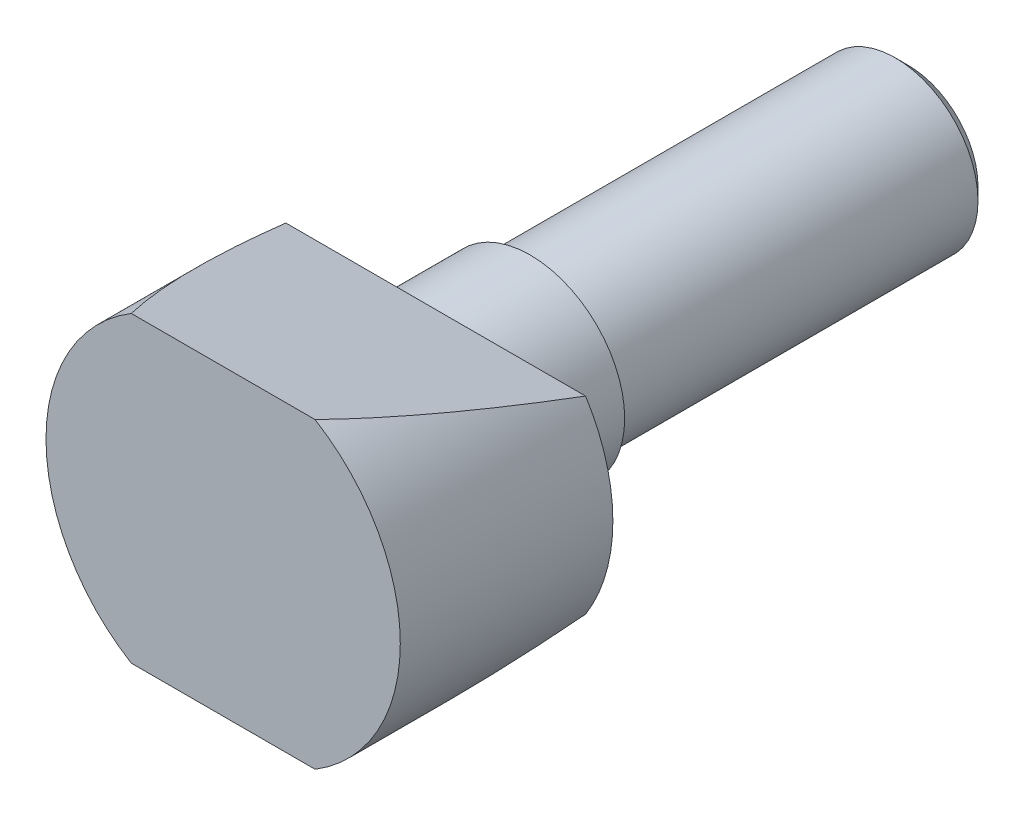
ISO-10303-21;
HEADER;
FILE_DESCRIPTION(('STEP AP214'),'2;1');
FILE_NAME('part.step','',(''),(''),'','','');
FILE_SCHEMA(('AUTOMOTIVE_DESIGN { 1 0 10303 214 1 1 1 1 }'));
ENDSEC;
DATA;
#1=APPLICATION_CONTEXT('core data for automotive mechanical design processes');
#2=APPLICATION_PROTOCOL_DEFINITION('international standard','automotive_design',2000,#1);
#3=PRODUCT_CONTEXT('',#1,'mechanical');
#4=PRODUCT('Part','Part','',(#3));
#5=PRODUCT_RELATED_PRODUCT_CATEGORY('part','',(#4));
#6=PRODUCT_DEFINITION_FORMATION('','',#4);
#7=PRODUCT_DEFINITION_CONTEXT('part definition',#1,'design');
#8=PRODUCT_DEFINITION('design','',#6,#7);
#9=PRODUCT_DEFINITION_SHAPE('','',#8);
#10=(LENGTH_UNIT() NAMED_UNIT(*) SI_UNIT(.MILLI.,.METRE.));
#11=(NAMED_UNIT(*) PLANE_ANGLE_UNIT() SI_UNIT($,.RADIAN.));
#12=(NAMED_UNIT(*) SI_UNIT($,.STERADIAN.) SOLID_ANGLE_UNIT());
#13=UNCERTAINTY_MEASURE_WITH_UNIT(LENGTH_MEASURE(1.E-05),#10,'distance_accuracy_value','');
#14=(GEOMETRIC_REPRESENTATION_CONTEXT(3) GLOBAL_UNCERTAINTY_ASSIGNED_CONTEXT((#13)) GLOBAL_UNIT_ASSIGNED_CONTEXT((#10,
#11,#12)) REPRESENTATION_CONTEXT('',''));
#15=CARTESIAN_POINT('',(0.,0.,0.));
#16=DIRECTION('',(0.,0.,1.));
#17=DIRECTION('',(1.,0.,0.));
#18=AXIS2_PLACEMENT_3D('',#15,#16,#17);
#19=CARTESIAN_POINT('',(0.,0.,40.));
#20=DIRECTION('',(0.,0.,1.));
#21=DIRECTION('',(1.,0.,0.));
#22=AXIS2_PLACEMENT_3D('',#19,#20,#21);
#23=PLANE('',#22);
#24=CARTESIAN_POINT('',(0.,0.,40.));
#25=DIRECTION('',(0.,0.,1.));
#26=DIRECTION('',(1.,0.,0.));
#27=AXIS2_PLACEMENT_3D('',#24,#25,#26);
#28=CIRCLE('',#27,15.);
#29=CARTESIAN_POINT('',(12.6885775404495,-8.00000000000001,40.));
#30=VERTEX_POINT('',#29);
#31=CARTESIAN_POINT('',(12.6885775404495,8.,40.));
#32=VERTEX_POINT('',#31);
#33=EDGE_CURVE('E111',#30,#32,#28,.T.);
#34=ORIENTED_EDGE('',*,*,#33,.F.);
#35=DIRECTION('',(-1.,0.,0.));
#36=VECTOR('',#35,1.);
#37=CARTESIAN_POINT('',(104.585402158183,-8.,40.));
#38=LINE('',#37,#36);
#39=CARTESIAN_POINT('',(0.,-8.,40.));
#40=VERTEX_POINT('',#39);
#41=EDGE_CURVE('E67',#30,#40,#38,.T.);
#42=ORIENTED_EDGE('',*,*,#41,.T.);
#43=CARTESIAN_POINT('',(0.,0.,40.));
#44=DIRECTION('',(0.,0.,1.));
#45=DIRECTION('',(1.,0.,0.));
#46=AXIS2_PLACEMENT_3D('',#43,#44,#45);
#47=CIRCLE('',#46,8.);
#48=CARTESIAN_POINT('',(0.,8.,40.));
#49=VERTEX_POINT('',#48);
#50=EDGE_CURVE('E130',#40,#49,#47,.T.);
#51=ORIENTED_EDGE('',*,*,#50,.T.);
#52=DIRECTION('',(-1.,0.,0.));
#53=VECTOR('',#52,1.);
#54=CARTESIAN_POINT('',(99.8262211161084,8.,40.));
#55=LINE('',#54,#53);
#56=EDGE_CURVE('E136',#32,#49,#55,.T.);
#57=ORIENTED_EDGE('',*,*,#56,.F.);
#58=EDGE_LOOP('',(#34,#42,#51,#57));
#59=FACE_BOUND('',#58,.T.);
#60=ADVANCED_FACE('F51',(#59),#23,.F.);
#61=CARTESIAN_POINT('',(0.,0.,158.426406871193));
#62=DIRECTION('',(0.,0.,-1.));
#63=DIRECTION('',(-1.,0.,0.));
#64=AXIS2_PLACEMENT_3D('',#61,#62,#63);
#65=CYLINDRICAL_SURFACE('',#64,15.);
#66=CARTESIAN_POINT('',(0.,0.,10.143593539449));
#67=DIRECTION('',(0.,-0.965925826289068,-0.258819045102521));
#68=DIRECTION('',(0.,0.258819045102521,-0.965925826289068));
#69=AXIS2_PLACEMENT_3D('',#66,#67,#68);
#70=ELLIPSE('',#69,57.955549577344,15.);
#71=CARTESIAN_POINT('',(7.78257535711035,-12.8230854637602,58.));
#72=VERTEX_POINT('',#71);
#73=EDGE_CURVE('E12',#30,#72,#70,.T.);
#74=ORIENTED_EDGE('',*,*,#73,.F.);
#75=ORIENTED_EDGE('',*,*,#33,.T.);
#76=CARTESIAN_POINT('',(0.,0.,10.143593539449));
#77=DIRECTION('',(0.,-0.965925826289068,0.258819045102521));
#78=DIRECTION('',(0.,-0.258819045102521,-0.965925826289068));
#79=AXIS2_PLACEMENT_3D('',#76,#77,#78);
#80=ELLIPSE('',#79,57.955549577344,15.);
#81=CARTESIAN_POINT('',(7.78257535711036,12.8230854637602,58.));
#82=VERTEX_POINT('',#81);
#83=EDGE_CURVE('E138',#32,#82,#80,.T.);
#84=ORIENTED_EDGE('',*,*,#83,.T.);
#85=CARTESIAN_POINT('',(0.,0.,58.));
#86=DIRECTION('',(0.,0.,1.));
#87=DIRECTION('',(1.,0.,0.));
#88=AXIS2_PLACEMENT_3D('',#85,#86,#87);
#89=CIRCLE('',#88,15.);
#90=EDGE_CURVE('E110',#72,#82,#89,.T.);
#91=ORIENTED_EDGE('',*,*,#90,.F.);
#92=EDGE_LOOP('',(#74,#75,#84,#91));
#93=FACE_BOUND('',#92,.T.);
#94=ADVANCED_FACE('F183',(#93),#65,.T.);
#95=CARTESIAN_POINT('',(-7.78257535711035,-12.8230854637602,58.));
#96=VERTEX_POINT('',#95);
#97=CARTESIAN_POINT('',(-12.6885775404495,-8.,40.));
#98=VERTEX_POINT('',#97);
#99=EDGE_CURVE('E55',#96,#98,#70,.T.);
#100=ORIENTED_EDGE('',*,*,#99,.F.);
#101=CARTESIAN_POINT('',(-7.78257535711036,12.8230854637602,58.));
#102=VERTEX_POINT('',#101);
#103=EDGE_CURVE('E140',#102,#96,#89,.T.);
#104=ORIENTED_EDGE('',*,*,#103,.F.);
#105=CARTESIAN_POINT('',(-12.6885775404495,8.,40.));
#106=VERTEX_POINT('',#105);
#107=EDGE_CURVE('E106',#102,#106,#80,.T.);
#108=ORIENTED_EDGE('',*,*,#107,.T.);
#109=EDGE_CURVE('E101',#106,#98,#28,.T.);
#110=ORIENTED_EDGE('',*,*,#109,.T.);
#111=EDGE_LOOP('',(#100,#104,#108,#110));
#112=FACE_BOUND('',#111,.T.);
#113=ADVANCED_FACE('F103',(#112),#65,.T.);
#114=EDGE_CURVE('E118',#49,#40,#47,.T.);
#115=ORIENTED_EDGE('',*,*,#114,.T.);
#116=EDGE_CURVE('E115',#40,#98,#38,.T.);
#117=ORIENTED_EDGE('',*,*,#116,.T.);
#118=ORIENTED_EDGE('',*,*,#109,.F.);
#119=EDGE_CURVE('E133',#49,#106,#55,.T.);
#120=ORIENTED_EDGE('',*,*,#119,.F.);
#121=EDGE_LOOP('',(#115,#117,#118,#120));
#122=FACE_BOUND('',#121,.T.);
#123=ADVANCED_FACE('F116',(#122),#23,.F.);
#124=CARTESIAN_POINT('',(0.,0.,58.));
#125=DIRECTION('',(0.,0.,1.));
#126=DIRECTION('',(1.,0.,0.));
#127=AXIS2_PLACEMENT_3D('',#124,#125,#126);
#128=PLANE('',#127);
#129=DIRECTION('',(-1.,0.,0.));
#130=VECTOR('',#129,1.);
#131=CARTESIAN_POINT('',(104.585402158183,-12.8230854637602,58.));
#132=LINE('',#131,#130);
#133=EDGE_CURVE('E75',#72,#96,#132,.T.);
#134=ORIENTED_EDGE('',*,*,#133,.F.);
#135=ORIENTED_EDGE('',*,*,#90,.T.);
#136=DIRECTION('',(-1.,0.,0.));
#137=VECTOR('',#136,1.);
#138=CARTESIAN_POINT('',(99.8262211161084,12.8230854637602,58.));
#139=LINE('',#138,#137);
#140=EDGE_CURVE('E124',#82,#102,#139,.T.);
#141=ORIENTED_EDGE('',*,*,#140,.T.);
#142=ORIENTED_EDGE('',*,*,#103,.T.);
#143=EDGE_LOOP('',(#134,#135,#141,#142));
#144=FACE_BOUND('',#143,.T.);
#145=ADVANCED_FACE('F171',(#144),#128,.T.);
#146=CARTESIAN_POINT('',(0.,0.,40.));
#147=DIRECTION('',(0.,0.,-1.));
#148=DIRECTION('',(-1.,0.,0.));
#149=AXIS2_PLACEMENT_3D('',#146,#147,#148);
#150=CYLINDRICAL_SURFACE('',#149,8.);
#151=CARTESIAN_POINT('',(0.,0.,32.));
#152=DIRECTION('',(0.,0.,1.));
#153=DIRECTION('',(1.,0.,0.));
#154=AXIS2_PLACEMENT_3D('',#151,#152,#153);
#155=CIRCLE('',#154,8.);
#156=CARTESIAN_POINT('',(8.,0.,32.));
#157=VERTEX_POINT('',#156);
#158=EDGE_CURVE('E151',#157,#157,#155,.T.);
#159=ORIENTED_EDGE('',*,*,#158,.T.);
#160=EDGE_LOOP('',(#159));
#161=FACE_BOUND('',#160,.T.);
#162=ORIENTED_EDGE('',*,*,#114,.F.);
#163=ORIENTED_EDGE('',*,*,#50,.F.);
#164=EDGE_LOOP('',(#162,#163));
#165=FACE_BOUND('',#164,.T.);
#166=ADVANCED_FACE('F53',(#161,#165),#150,.T.);
#167=CARTESIAN_POINT('',(0.,0.,0.));
#168=DIRECTION('',(0.,0.,1.));
#169=DIRECTION('',(1.,0.,0.));
#170=AXIS2_PLACEMENT_3D('',#167,#168,#169);
#171=CYLINDRICAL_SURFACE('',#170,7.);
#172=CARTESIAN_POINT('',(0.,0.,32.));
#173=DIRECTION('',(0.,0.,1.));
#174=DIRECTION('',(1.,0.,0.));
#175=AXIS2_PLACEMENT_3D('',#172,#173,#174);
#176=CIRCLE('',#175,7.);
#177=CARTESIAN_POINT('',(7.,0.,32.));
#178=VERTEX_POINT('',#177);
#179=EDGE_CURVE('E155',#178,#178,#176,.T.);
#180=ORIENTED_EDGE('',*,*,#179,.F.);
#181=EDGE_LOOP('',(#180));
#182=FACE_BOUND('',#181,.T.);
#183=CARTESIAN_POINT('',(0.,0.,1.0825));
#184=DIRECTION('',(0.,0.,1.));
#185=DIRECTION('',(1.,0.,0.));
#186=AXIS2_PLACEMENT_3D('',#183,#184,#185);
#187=CIRCLE('',#186,7.);
#188=CARTESIAN_POINT('',(7.,0.,1.0825));
#189=VERTEX_POINT('',#188);
#190=EDGE_CURVE('E143',#189,#189,#187,.T.);
#191=ORIENTED_EDGE('',*,*,#190,.T.);
#192=EDGE_LOOP('',(#191));
#193=FACE_BOUND('',#192,.T.);
#194=ADVANCED_FACE('F170',(#182,#193),#171,.T.);
#195=CARTESIAN_POINT('',(7.,0.,32.));
#196=DIRECTION('',(0.,0.,1.));
#197=DIRECTION('',(1.,0.,0.));
#198=AXIS2_PLACEMENT_3D('',#195,#196,#197);
#199=PLANE('',#198);
#200=ORIENTED_EDGE('',*,*,#158,.F.);
#201=EDGE_LOOP('',(#200));
#202=FACE_BOUND('',#201,.T.);
#203=ORIENTED_EDGE('',*,*,#179,.T.);
#204=EDGE_LOOP('',(#203));
#205=FACE_BOUND('',#204,.T.);
#206=ADVANCED_FACE('F178',(#202,#205),#199,.F.);
#207=CARTESIAN_POINT('',(0.,0.,0.));
#208=DIRECTION('',(0.,0.,1.));
#209=DIRECTION('',(1.,0.,0.));
#210=AXIS2_PLACEMENT_3D('',#207,#208,#209);
#211=CONICAL_SURFACE('',#210,5.9175,0.785398163397449);
#212=ORIENTED_EDGE('',*,*,#190,.F.);
#213=EDGE_LOOP('',(#212));
#214=FACE_BOUND('',#213,.T.);
#215=CARTESIAN_POINT('',(0.,0.,0.));
#216=DIRECTION('',(0.,0.,1.));
#217=DIRECTION('',(1.,0.,0.));
#218=AXIS2_PLACEMENT_3D('',#215,#216,#217);
#219=CIRCLE('',#218,5.9175);
#220=CARTESIAN_POINT('',(5.9175,0.,0.));
#221=VERTEX_POINT('',#220);
#222=EDGE_CURVE('E147',#221,#221,#219,.T.);
#223=ORIENTED_EDGE('',*,*,#222,.T.);
#224=EDGE_LOOP('',(#223));
#225=FACE_BOUND('',#224,.T.);
#226=ADVANCED_FACE('F199',(#214,#225),#211,.T.);
#227=CARTESIAN_POINT('',(0.,0.,0.));
#228=DIRECTION('',(0.,0.,1.));
#229=DIRECTION('',(1.,0.,0.));
#230=AXIS2_PLACEMENT_3D('',#227,#228,#229);
#231=PLANE('',#230);
#232=ORIENTED_EDGE('',*,*,#222,.F.);
#233=EDGE_LOOP('',(#232));
#234=FACE_BOUND('',#233,.T.);
#235=ADVANCED_FACE('F202',(#234),#231,.F.);
#236=CARTESIAN_POINT('',(99.8262211161084,8.,40.));
#237=DIRECTION('',(0.,-0.965925826289068,0.258819045102521));
#238=DIRECTION('',(0.,-0.258819045102521,-0.965925826289068));
#239=AXIS2_PLACEMENT_3D('',#236,#237,#238);
#240=PLANE('',#239);
#241=ORIENTED_EDGE('',*,*,#83,.F.);
#242=ORIENTED_EDGE('',*,*,#56,.T.);
#243=ORIENTED_EDGE('',*,*,#119,.T.);
#244=ORIENTED_EDGE('',*,*,#107,.F.);
#245=ORIENTED_EDGE('',*,*,#140,.F.);
#246=EDGE_LOOP('',(#241,#242,#243,#244,#245));
#247=FACE_BOUND('',#246,.T.);
#248=ADVANCED_FACE('F166',(#247),#240,.F.);
#249=CARTESIAN_POINT('',(104.585402158183,-8.,40.));
#250=DIRECTION('',(0.,-0.965925826289068,-0.258819045102521));
#251=DIRECTION('',(0.,0.258819045102521,-0.965925826289068));
#252=AXIS2_PLACEMENT_3D('',#249,#250,#251);
#253=PLANE('',#252);
#254=ORIENTED_EDGE('',*,*,#41,.F.);
#255=ORIENTED_EDGE('',*,*,#73,.T.);
#256=ORIENTED_EDGE('',*,*,#133,.T.);
#257=ORIENTED_EDGE('',*,*,#99,.T.);
#258=ORIENTED_EDGE('',*,*,#116,.F.);
#259=EDGE_LOOP('',(#254,#255,#256,#257,#258));
#260=FACE_BOUND('',#259,.T.);
#261=ADVANCED_FACE('F122',(#260),#253,.T.);
#262=CLOSED_SHELL('',(#60,#94,#113,#123,#145,#166,#194,#206,#226,#235,#248,#261));
#263=MANIFOLD_SOLID_BREP('B2',#262);
#264=ADVANCED_BREP_SHAPE_REPRESENTATION('',(#18,#263),#14);
#265=SHAPE_DEFINITION_REPRESENTATION(#9,#264);
ENDSEC;
END-ISO-10303-21;
